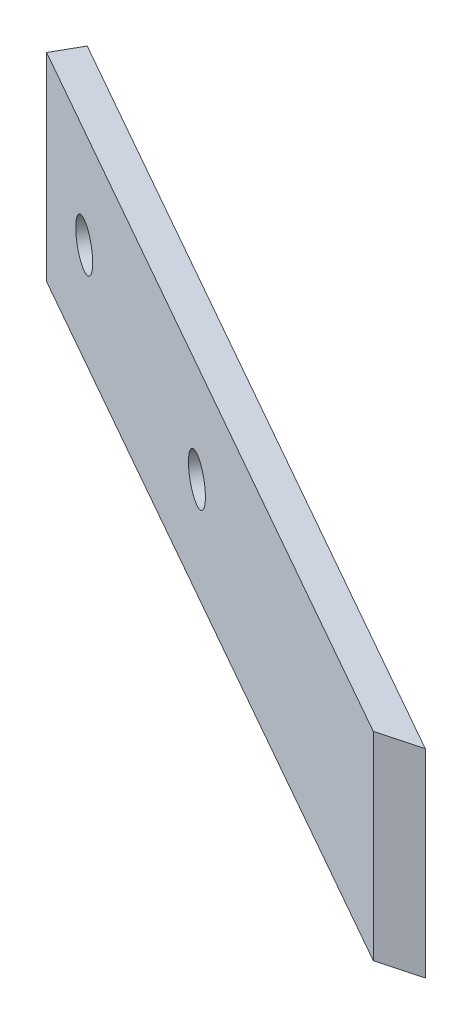
ISO-10303-21;
HEADER;
FILE_DESCRIPTION(('STEP AP214'),'2;1');
FILE_NAME('part.step','',(''),(''),'','','');
FILE_SCHEMA(('AUTOMOTIVE_DESIGN { 1 0 10303 214 1 1 1 1 }'));
ENDSEC;
DATA;
#1=APPLICATION_CONTEXT('core data for automotive mechanical design processes');
#2=APPLICATION_PROTOCOL_DEFINITION('international standard','automotive_design',2000,#1);
#3=PRODUCT_CONTEXT('',#1,'mechanical');
#4=PRODUCT('Part','Part','',(#3));
#5=PRODUCT_RELATED_PRODUCT_CATEGORY('part','',(#4));
#6=PRODUCT_DEFINITION_FORMATION('','',#4);
#7=PRODUCT_DEFINITION_CONTEXT('part definition',#1,'design');
#8=PRODUCT_DEFINITION('design','',#6,#7);
#9=PRODUCT_DEFINITION_SHAPE('','',#8);
#10=(LENGTH_UNIT() NAMED_UNIT(*) SI_UNIT(.MILLI.,.METRE.));
#11=(NAMED_UNIT(*) PLANE_ANGLE_UNIT() SI_UNIT($,.RADIAN.));
#12=(NAMED_UNIT(*) SI_UNIT($,.STERADIAN.) SOLID_ANGLE_UNIT());
#13=UNCERTAINTY_MEASURE_WITH_UNIT(LENGTH_MEASURE(1.E-05),#10,'distance_accuracy_value','');
#14=(GEOMETRIC_REPRESENTATION_CONTEXT(3) GLOBAL_UNCERTAINTY_ASSIGNED_CONTEXT((#13)) GLOBAL_UNIT_ASSIGNED_CONTEXT((#10,
#11,#12)) REPRESENTATION_CONTEXT('',''));
#15=CARTESIAN_POINT('',(0.,0.,0.));
#16=DIRECTION('',(0.,0.,1.));
#17=DIRECTION('',(1.,0.,0.));
#18=AXIS2_PLACEMENT_3D('',#15,#16,#17);
#19=CARTESIAN_POINT('',(664.91620801973,0.,1742.945025343));
#20=DIRECTION('',(0.49204639102187,0.,-0.870568980082769));
#21=DIRECTION('',(0.87056898008277,0.,0.49204639102187));
#22=AXIS2_PLACEMENT_3D('',#19,#20,#21);
#23=CYLINDRICAL_SURFACE('',#22,4.5);
#24=CARTESIAN_POINT('',(662.94310199173,0.,1746.436006953));
#25=DIRECTION('',(0.49204639102187,0.,-0.870568980082769));
#26=DIRECTION('',(0.870568980082769,0.,0.49204639102187));
#27=AXIS2_PLACEMENT_3D('',#24,#25,#26);
#28=CIRCLE('',#27,4.5);
#29=CARTESIAN_POINT('',(666.8606624021,0.,1748.650215712));
#30=VERTEX_POINT('',#29);
#31=EDGE_CURVE('E122',#30,#30,#28,.T.);
#32=ORIENTED_EDGE('',*,*,#31,.T.);
#33=DIRECTION('',(-0.49204639102187,0.,0.870568980082769));
#34=VECTOR('',#33,1.);
#35=CARTESIAN_POINT('',(668.8337684301,0.,1745.159234102));
#36=LINE('',#35,#34);
#37=CARTESIAN_POINT('',(663.90838405597,0.,1753.873629593));
#38=VERTEX_POINT('',#37);
#39=EDGE_CURVE('E11',#30,#38,#36,.T.);
#40=ORIENTED_EDGE('',*,*,#39,.T.);
#41=CARTESIAN_POINT('',(659.9908236456,0.,1751.659420833));
#42=DIRECTION('',(0.49204639102187,0.,-0.870568980082769));
#43=DIRECTION('',(0.870568980082769,0.,0.49204639102187));
#44=AXIS2_PLACEMENT_3D('',#41,#42,#43);
#45=CIRCLE('',#44,4.5);
#46=EDGE_CURVE('E141',#38,#38,#45,.T.);
#47=ORIENTED_EDGE('',*,*,#46,.F.);
#48=ORIENTED_EDGE('',*,*,#39,.F.);
#49=EDGE_LOOP('',(#32,#40,#47,#48));
#50=FACE_BOUND('',#49,.T.);
#51=ADVANCED_FACE('F17',(#50),#23,.F.);
#52=CARTESIAN_POINT('',(612.68206921477,0.,1713.422241881));
#53=DIRECTION('',(0.49204639102187,0.,-0.870568980082769));
#54=DIRECTION('',(0.87056898008277,0.,0.49204639102187));
#55=AXIS2_PLACEMENT_3D('',#52,#53,#54);
#56=CYLINDRICAL_SURFACE('',#55,4.5);
#57=CARTESIAN_POINT('',(610.70896318677,0.,1716.913223492));
#58=DIRECTION('',(0.49204639102187,0.,-0.870568980082769));
#59=DIRECTION('',(0.870568980082769,0.,0.49204639102187));
#60=AXIS2_PLACEMENT_3D('',#57,#58,#59);
#61=CIRCLE('',#60,4.5);
#62=CARTESIAN_POINT('',(614.62652359714,0.,1719.127432251));
#63=VERTEX_POINT('',#62);
#64=EDGE_CURVE('E124',#63,#63,#61,.T.);
#65=ORIENTED_EDGE('',*,*,#64,.T.);
#66=DIRECTION('',(-0.49204639102187,0.,0.870568980082769));
#67=VECTOR('',#66,1.);
#68=CARTESIAN_POINT('',(616.59962962514,0.,1715.636450641));
#69=LINE('',#68,#67);
#70=CARTESIAN_POINT('',(611.67424525101,0.,1724.350846132));
#71=VERTEX_POINT('',#70);
#72=EDGE_CURVE('E25',#63,#71,#69,.T.);
#73=ORIENTED_EDGE('',*,*,#72,.T.);
#74=CARTESIAN_POINT('',(607.75668484064,0.,1722.136637372));
#75=DIRECTION('',(0.49204639102187,0.,-0.870568980082769));
#76=DIRECTION('',(0.870568980082769,0.,0.49204639102187));
#77=AXIS2_PLACEMENT_3D('',#74,#75,#76);
#78=CIRCLE('',#77,4.5);
#79=EDGE_CURVE('E137',#71,#71,#78,.T.);
#80=ORIENTED_EDGE('',*,*,#79,.F.);
#81=ORIENTED_EDGE('',*,*,#72,.F.);
#82=EDGE_LOOP('',(#65,#73,#80,#81));
#83=FACE_BOUND('',#82,.T.);
#84=ADVANCED_FACE('F156',(#83),#56,.F.);
#85=CARTESIAN_POINT('',(-7.764571353077,0.,1998.683051002));
#86=DIRECTION('',(-0.258819045102985,0.,-0.965925826288944));
#87=DIRECTION('',(-0.965925826288944,0.,0.258819045102985));
#88=AXIS2_PLACEMENT_3D('',#85,#86,#87);
#89=PLANE('',#88);
#90=DIRECTION('',(0.,-1.,0.));
#91=VECTOR('',#90,1.);
#92=CARTESIAN_POINT('',(741.72772805359,-10.,1797.857194643));
#93=LINE('',#92,#91);
#94=CARTESIAN_POINT('',(741.72772805359,20.,1797.857194643));
#95=VERTEX_POINT('',#94);
#96=CARTESIAN_POINT('',(741.72772805359,-20.,1797.857194643));
#97=VERTEX_POINT('',#96);
#98=EDGE_CURVE('E131',#95,#97,#93,.T.);
#99=ORIENTED_EDGE('',*,*,#98,.T.);
#100=DIRECTION('',(-0.965925826288944,0.,0.258819045102985));
#101=VECTOR('',#100,1.);
#102=CARTESIAN_POINT('',(309.08608565531,-20.,1913.783173335));
#103=LINE('',#102,#101);
#104=CARTESIAN_POINT('',(750.,-20.,1795.640646055));
#105=VERTEX_POINT('',#104);
#106=EDGE_CURVE('E93',#105,#97,#103,.T.);
#107=ORIENTED_EDGE('',*,*,#106,.F.);
#108=DIRECTION('',(0.,1.,0.));
#109=VECTOR('',#108,1.);
#110=CARTESIAN_POINT('',(750.,-20.,1795.640646055));
#111=LINE('',#110,#109);
#112=CARTESIAN_POINT('',(750.,20.,1795.640646055));
#113=VERTEX_POINT('',#112);
#114=EDGE_CURVE('E126',#105,#113,#111,.T.);
#115=ORIENTED_EDGE('',*,*,#114,.T.);
#116=DIRECTION('',(-0.965925826288944,0.,0.258819045102985));
#117=VECTOR('',#116,1.);
#118=CARTESIAN_POINT('',(309.08608565531,20.,1913.783173335));
#119=LINE('',#118,#117);
#120=EDGE_CURVE('E147',#113,#95,#119,.T.);
#121=ORIENTED_EDGE('',*,*,#120,.T.);
#122=EDGE_LOOP('',(#99,#107,#115,#121));
#123=FACE_BOUND('',#122,.T.);
#124=ADVANCED_FACE('F178',(#123),#89,.F.);
#125=CARTESIAN_POINT('',(593.29758358512,-20.,1707.072295671));
#126=DIRECTION('',(-0.49204639102187,0.,0.870568980082769));
#127=DIRECTION('',(0.,1.,0.));
#128=AXIS2_PLACEMENT_3D('',#125,#126,#127);
#129=PLANE('',#128);
#130=ORIENTED_EDGE('',*,*,#31,.F.);
#131=EDGE_LOOP('',(#130));
#132=FACE_BOUND('',#131,.T.);
#133=ORIENTED_EDGE('',*,*,#64,.F.);
#134=EDGE_LOOP('',(#133));
#135=FACE_BOUND('',#134,.T.);
#136=DIRECTION('',(0.870568980082769,0.,0.49204639102187));
#137=VECTOR('',#136,1.);
#138=CARTESIAN_POINT('',(593.29758358512,20.,1707.072295671));
#139=LINE('',#138,#137);
#140=CARTESIAN_POINT('',(593.29758358512,20.,1707.072295671));
#141=VERTEX_POINT('',#140);
#142=EDGE_CURVE('E129',#141,#113,#139,.T.);
#143=ORIENTED_EDGE('',*,*,#142,.T.);
#144=ORIENTED_EDGE('',*,*,#114,.F.);
#145=DIRECTION('',(0.870568980082769,0.,0.49204639102187));
#146=VECTOR('',#145,1.);
#147=CARTESIAN_POINT('',(593.29758358512,-20.,1707.072295671));
#148=LINE('',#147,#146);
#149=CARTESIAN_POINT('',(593.29758358512,-20.,1707.072295671));
#150=VERTEX_POINT('',#149);
#151=EDGE_CURVE('E98',#150,#105,#148,.T.);
#152=ORIENTED_EDGE('',*,*,#151,.F.);
#153=DIRECTION('',(0.,1.,0.));
#154=VECTOR('',#153,1.);
#155=CARTESIAN_POINT('',(593.29758358512,-20.,1707.072295671));
#156=LINE('',#155,#154);
#157=EDGE_CURVE('E106',#150,#141,#156,.T.);
#158=ORIENTED_EDGE('',*,*,#157,.T.);
#159=EDGE_LOOP('',(#143,#144,#152,#158));
#160=FACE_BOUND('',#159,.T.);
#161=ADVANCED_FACE('F170',(#132,#135,#160),#129,.F.);
#162=CARTESIAN_POINT('',(593.29758358512,20.,1707.072295671));
#163=DIRECTION('',(0.,1.,0.));
#164=DIRECTION('',(1.,0.,0.));
#165=AXIS2_PLACEMENT_3D('',#162,#163,#164);
#166=PLANE('',#165);
#167=ORIENTED_EDGE('',*,*,#120,.F.);
#168=ORIENTED_EDGE('',*,*,#142,.F.);
#169=DIRECTION('',(-0.49204639102187,0.,0.870568980082769));
#170=VECTOR('',#169,1.);
#171=CARTESIAN_POINT('',(593.29758358512,20.,1707.072295671));
#172=LINE('',#171,#170);
#173=CARTESIAN_POINT('',(590.34530523898,20.,1712.295709552));
#174=VERTEX_POINT('',#173);
#175=EDGE_CURVE('E114',#141,#174,#172,.T.);
#176=ORIENTED_EDGE('',*,*,#175,.T.);
#177=DIRECTION('',(0.870568980082769,0.,0.49204639102187));
#178=VECTOR('',#177,1.);
#179=CARTESIAN_POINT('',(590.34530523898,20.,1712.295709552));
#180=LINE('',#179,#178);
#181=EDGE_CURVE('E111',#174,#95,#180,.T.);
#182=ORIENTED_EDGE('',*,*,#181,.T.);
#183=EDGE_LOOP('',(#167,#168,#176,#182));
#184=FACE_BOUND('',#183,.T.);
#185=ADVANCED_FACE('F160',(#184),#166,.T.);
#186=CARTESIAN_POINT('',(590.34530523898,-20.,1712.295709552));
#187=DIRECTION('',(-0.49204639102187,0.,0.870568980082769));
#188=DIRECTION('',(0.,1.,0.));
#189=AXIS2_PLACEMENT_3D('',#186,#187,#188);
#190=PLANE('',#189);
#191=ORIENTED_EDGE('',*,*,#46,.T.);
#192=EDGE_LOOP('',(#191));
#193=FACE_BOUND('',#192,.T.);
#194=ORIENTED_EDGE('',*,*,#79,.T.);
#195=EDGE_LOOP('',(#194));
#196=FACE_BOUND('',#195,.T.);
#197=ORIENTED_EDGE('',*,*,#181,.F.);
#198=DIRECTION('',(0.,1.,0.));
#199=VECTOR('',#198,1.);
#200=CARTESIAN_POINT('',(590.34530523898,-20.,1712.295709552));
#201=LINE('',#200,#199);
#202=CARTESIAN_POINT('',(590.34530523898,-20.,1712.295709552));
#203=VERTEX_POINT('',#202);
#204=EDGE_CURVE('E104',#203,#174,#201,.T.);
#205=ORIENTED_EDGE('',*,*,#204,.F.);
#206=DIRECTION('',(0.870568980082769,0.,0.49204639102187));
#207=VECTOR('',#206,1.);
#208=CARTESIAN_POINT('',(590.34530523898,-20.,1712.295709552));
#209=LINE('',#208,#207);
#210=EDGE_CURVE('E86',#203,#97,#209,.T.);
#211=ORIENTED_EDGE('',*,*,#210,.T.);
#212=ORIENTED_EDGE('',*,*,#98,.F.);
#213=EDGE_LOOP('',(#197,#205,#211,#212));
#214=FACE_BOUND('',#213,.T.);
#215=ADVANCED_FACE('F109',(#193,#196,#214),#190,.T.);
#216=CARTESIAN_POINT('',(593.29758358512,-20.,1707.072295671));
#217=DIRECTION('',(0.,1.,0.));
#218=DIRECTION('',(1.,0.,0.));
#219=AXIS2_PLACEMENT_3D('',#216,#217,#218);
#220=PLANE('',#219);
#221=ORIENTED_EDGE('',*,*,#210,.F.);
#222=DIRECTION('',(-0.49204639102187,0.,0.870568980082769));
#223=VECTOR('',#222,1.);
#224=CARTESIAN_POINT('',(593.29758358512,-20.,1707.072295671));
#225=LINE('',#224,#223);
#226=EDGE_CURVE('E90',#150,#203,#225,.T.);
#227=ORIENTED_EDGE('',*,*,#226,.F.);
#228=ORIENTED_EDGE('',*,*,#151,.T.);
#229=ORIENTED_EDGE('',*,*,#106,.T.);
#230=EDGE_LOOP('',(#221,#227,#228,#229));
#231=FACE_BOUND('',#230,.T.);
#232=ADVANCED_FACE('F88',(#231),#220,.F.);
#233=CARTESIAN_POINT('',(593.29758358512,-20.,1707.072295671));
#234=DIRECTION('',(0.870568980082769,0.,0.49204639102187));
#235=DIRECTION('',(0.,-1.,0.));
#236=AXIS2_PLACEMENT_3D('',#233,#234,#235);
#237=PLANE('',#236);
#238=ORIENTED_EDGE('',*,*,#204,.T.);
#239=ORIENTED_EDGE('',*,*,#175,.F.);
#240=ORIENTED_EDGE('',*,*,#157,.F.);
#241=ORIENTED_EDGE('',*,*,#226,.T.);
#242=EDGE_LOOP('',(#238,#239,#240,#241));
#243=FACE_BOUND('',#242,.T.);
#244=ADVANCED_FACE('F102',(#243),#237,.F.);
#245=CLOSED_SHELL('',(#51,#84,#124,#161,#185,#215,#232,#244));
#246=MANIFOLD_SOLID_BREP('B1',#245);
#247=ADVANCED_BREP_SHAPE_REPRESENTATION('',(#18,#246),#14);
#248=SHAPE_DEFINITION_REPRESENTATION(#9,#247);
ENDSEC;
END-ISO-10303-21;
